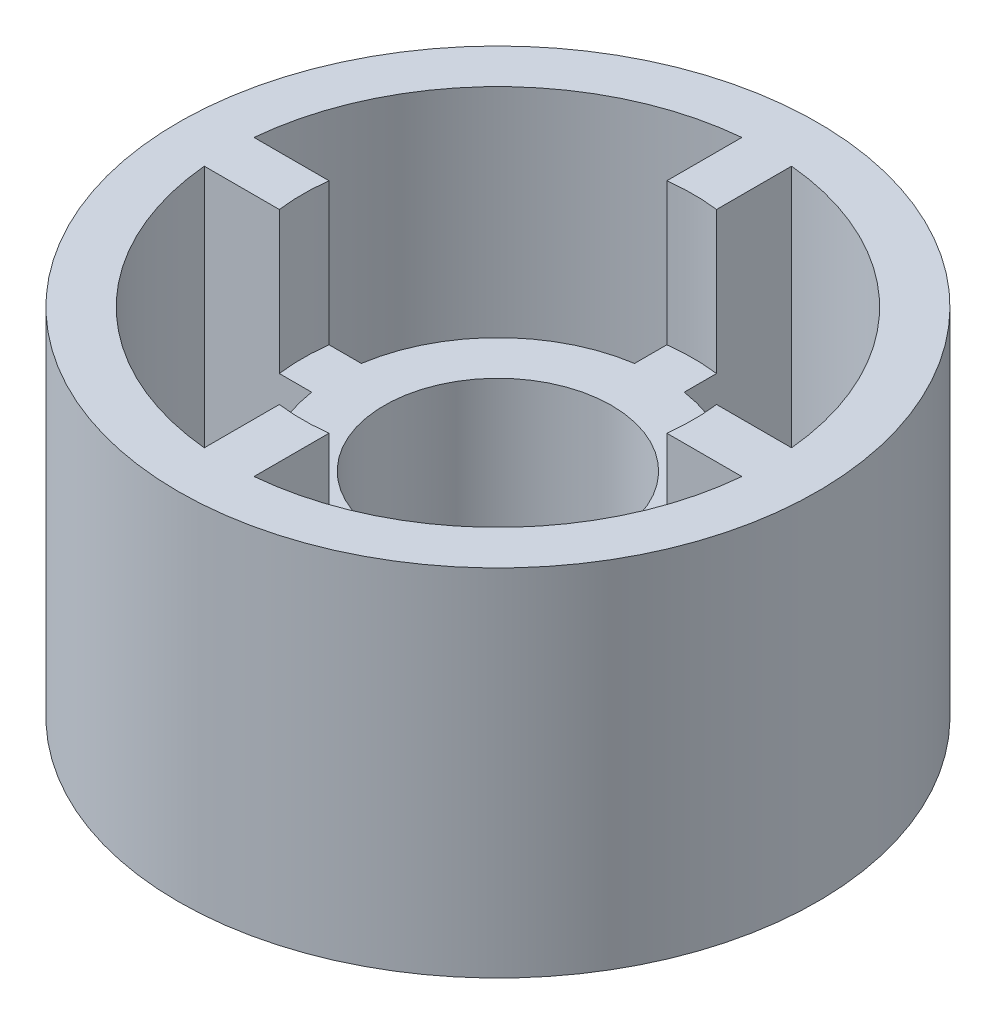
ISO-10303-21;
HEADER;
FILE_DESCRIPTION(('STEP AP214'),'2;1');
FILE_NAME('part.step','',(''),(''),'','','');
FILE_SCHEMA(('AUTOMOTIVE_DESIGN { 1 0 10303 214 1 1 1 1 }'));
ENDSEC;
DATA;
#1=APPLICATION_CONTEXT('core data for automotive mechanical design processes');
#2=APPLICATION_PROTOCOL_DEFINITION('international standard','automotive_design',2000,#1);
#3=PRODUCT_CONTEXT('',#1,'mechanical');
#4=PRODUCT('Part','Part','',(#3));
#5=PRODUCT_RELATED_PRODUCT_CATEGORY('part','',(#4));
#6=PRODUCT_DEFINITION_FORMATION('','',#4);
#7=PRODUCT_DEFINITION_CONTEXT('part definition',#1,'design');
#8=PRODUCT_DEFINITION('design','',#6,#7);
#9=PRODUCT_DEFINITION_SHAPE('','',#8);
#10=(LENGTH_UNIT() NAMED_UNIT(*) SI_UNIT(.MILLI.,.METRE.));
#11=(NAMED_UNIT(*) PLANE_ANGLE_UNIT() SI_UNIT($,.RADIAN.));
#12=(NAMED_UNIT(*) SI_UNIT($,.STERADIAN.) SOLID_ANGLE_UNIT());
#13=UNCERTAINTY_MEASURE_WITH_UNIT(LENGTH_MEASURE(1.E-05),#10,'distance_accuracy_value','');
#14=(GEOMETRIC_REPRESENTATION_CONTEXT(3) GLOBAL_UNCERTAINTY_ASSIGNED_CONTEXT((#13)) GLOBAL_UNIT_ASSIGNED_CONTEXT((#10,
#11,#12)) REPRESENTATION_CONTEXT('',''));
#15=CARTESIAN_POINT('',(0.,0.,0.));
#16=DIRECTION('',(0.,0.,1.));
#17=DIRECTION('',(1.,0.,0.));
#18=AXIS2_PLACEMENT_3D('',#15,#16,#17);
#19=CARTESIAN_POINT('',(0.,5.,0.));
#20=DIRECTION('',(0.,-1.,0.));
#21=DIRECTION('',(0.,0.,-1.));
#22=AXIS2_PLACEMENT_3D('',#19,#20,#21);
#23=CYLINDRICAL_SURFACE('',#22,1.6);
#24=CARTESIAN_POINT('',(0.,0.,0.));
#25=DIRECTION('',(0.,1.,0.));
#26=DIRECTION('',(0.,0.,1.));
#27=AXIS2_PLACEMENT_3D('',#24,#25,#26);
#28=CIRCLE('',#27,1.6);
#29=CARTESIAN_POINT('',(0.,0.,1.6));
#30=VERTEX_POINT('',#29);
#31=EDGE_CURVE('E284',#30,#30,#28,.T.);
#32=ORIENTED_EDGE('',*,*,#31,.F.);
#33=EDGE_LOOP('',(#32));
#34=FACE_BOUND('',#33,.T.);
#35=CARTESIAN_POINT('',(0.,3.,0.));
#36=DIRECTION('',(0.,1.,0.));
#37=DIRECTION('',(0.,0.,1.));
#38=AXIS2_PLACEMENT_3D('',#35,#36,#37);
#39=CIRCLE('',#38,1.6);
#40=CARTESIAN_POINT('',(0.,3.,1.6));
#41=VERTEX_POINT('',#40);
#42=EDGE_CURVE('E388',#41,#41,#39,.T.);
#43=ORIENTED_EDGE('',*,*,#42,.T.);
#44=EDGE_LOOP('',(#43));
#45=FACE_BOUND('',#44,.T.);
#46=ADVANCED_FACE('F35',(#34,#45),#23,.F.);
#47=CARTESIAN_POINT('',(0.,5.,0.));
#48=DIRECTION('',(0.,-1.,0.));
#49=DIRECTION('',(0.,0.,-1.));
#50=AXIS2_PLACEMENT_3D('',#47,#48,#49);
#51=CYLINDRICAL_SURFACE('',#50,2.3);
#52=DIRECTION('',(0.,-1.,0.));
#53=VECTOR('',#52,1.);
#54=CARTESIAN_POINT('',(0.35,5.,-2.27321358433386));
#55=LINE('',#54,#53);
#56=CARTESIAN_POINT('',(0.35,3.,-2.27321358433386));
#57=VERTEX_POINT('',#56);
#58=CARTESIAN_POINT('',(0.35,0.,-2.27321358433386));
#59=VERTEX_POINT('',#58);
#60=EDGE_CURVE('E266',#57,#59,#55,.T.);
#61=ORIENTED_EDGE('',*,*,#60,.F.);
#62=CARTESIAN_POINT('',(0.,3.,0.));
#63=DIRECTION('',(0.,1.,0.));
#64=DIRECTION('',(0.,0.,1.));
#65=AXIS2_PLACEMENT_3D('',#62,#63,#64);
#66=CIRCLE('',#65,2.3);
#67=CARTESIAN_POINT('',(2.27321358433386,3.,-0.35));
#68=VERTEX_POINT('',#67);
#69=EDGE_CURVE('E382',#57,#68,#66,.F.);
#70=ORIENTED_EDGE('',*,*,#69,.T.);
#71=DIRECTION('',(0.,-1.,0.));
#72=VECTOR('',#71,1.);
#73=CARTESIAN_POINT('',(2.27321358433386,5.,-0.35));
#74=LINE('',#73,#72);
#75=CARTESIAN_POINT('',(2.27321358433386,0.,-0.35));
#76=VERTEX_POINT('',#75);
#77=EDGE_CURVE('E282',#68,#76,#74,.T.);
#78=ORIENTED_EDGE('',*,*,#77,.T.);
#79=CARTESIAN_POINT('',(0.,0.,0.));
#80=DIRECTION('',(0.,-1.,0.));
#81=DIRECTION('',(0.,0.,1.));
#82=AXIS2_PLACEMENT_3D('',#79,#80,#81);
#83=CIRCLE('',#82,2.3);
#84=EDGE_CURVE('E256',#59,#76,#83,.T.);
#85=ORIENTED_EDGE('',*,*,#84,.F.);
#86=EDGE_LOOP('',(#61,#70,#78,#85));
#87=FACE_BOUND('',#86,.T.);
#88=ADVANCED_FACE('F454',(#87),#51,.T.);
#89=CARTESIAN_POINT('',(0.,5.,0.));
#90=DIRECTION('',(0.,-1.,0.));
#91=DIRECTION('',(0.,0.,-1.));
#92=AXIS2_PLACEMENT_3D('',#89,#90,#91);
#93=CYLINDRICAL_SURFACE('',#92,2.3);
#94=DIRECTION('',(0.,-1.,0.));
#95=VECTOR('',#94,1.);
#96=CARTESIAN_POINT('',(2.27321358433386,5.,0.35));
#97=LINE('',#96,#95);
#98=CARTESIAN_POINT('',(2.27321358433386,3.,0.35));
#99=VERTEX_POINT('',#98);
#100=CARTESIAN_POINT('',(2.27321358433386,0.,0.35));
#101=VERTEX_POINT('',#100);
#102=EDGE_CURVE('E240',#99,#101,#97,.T.);
#103=ORIENTED_EDGE('',*,*,#102,.F.);
#104=CARTESIAN_POINT('',(0.,3.,0.));
#105=DIRECTION('',(0.,1.,0.));
#106=DIRECTION('',(0.,0.,1.));
#107=AXIS2_PLACEMENT_3D('',#104,#105,#106);
#108=CIRCLE('',#107,2.3);
#109=CARTESIAN_POINT('',(0.35,3.,2.27321358433386));
#110=VERTEX_POINT('',#109);
#111=EDGE_CURVE('E375',#99,#110,#108,.F.);
#112=ORIENTED_EDGE('',*,*,#111,.T.);
#113=DIRECTION('',(0.,-1.,0.));
#114=VECTOR('',#113,1.);
#115=CARTESIAN_POINT('',(0.35,5.,2.27321358433386));
#116=LINE('',#115,#114);
#117=CARTESIAN_POINT('',(0.35,0.,2.27321358433386));
#118=VERTEX_POINT('',#117);
#119=EDGE_CURVE('E254',#110,#118,#116,.T.);
#120=ORIENTED_EDGE('',*,*,#119,.T.);
#121=CARTESIAN_POINT('',(0.,0.,0.));
#122=DIRECTION('',(0.,-1.,0.));
#123=DIRECTION('',(0.,0.,1.));
#124=AXIS2_PLACEMENT_3D('',#121,#122,#123);
#125=CIRCLE('',#124,2.3);
#126=EDGE_CURVE('E241',#101,#118,#125,.T.);
#127=ORIENTED_EDGE('',*,*,#126,.F.);
#128=EDGE_LOOP('',(#103,#112,#120,#127));
#129=FACE_BOUND('',#128,.T.);
#130=ADVANCED_FACE('F479',(#129),#93,.T.);
#131=CARTESIAN_POINT('',(0.,5.,0.));
#132=DIRECTION('',(0.,-1.,0.));
#133=DIRECTION('',(0.,0.,-1.));
#134=AXIS2_PLACEMENT_3D('',#131,#132,#133);
#135=CYLINDRICAL_SURFACE('',#134,2.3);
#136=DIRECTION('',(0.,-1.,0.));
#137=VECTOR('',#136,1.);
#138=CARTESIAN_POINT('',(-0.35,5.,2.27321358433386));
#139=LINE('',#138,#137);
#140=CARTESIAN_POINT('',(-0.35,3.,2.27321358433386));
#141=VERTEX_POINT('',#140);
#142=CARTESIAN_POINT('',(-0.35,0.,2.27321358433386));
#143=VERTEX_POINT('',#142);
#144=EDGE_CURVE('E327',#141,#143,#139,.T.);
#145=ORIENTED_EDGE('',*,*,#144,.F.);
#146=CARTESIAN_POINT('',(0.,3.,0.));
#147=DIRECTION('',(0.,1.,0.));
#148=DIRECTION('',(0.,0.,1.));
#149=AXIS2_PLACEMENT_3D('',#146,#147,#148);
#150=CIRCLE('',#149,2.3);
#151=CARTESIAN_POINT('',(-2.27321358433386,3.,0.35));
#152=VERTEX_POINT('',#151);
#153=EDGE_CURVE('E351',#141,#152,#150,.F.);
#154=ORIENTED_EDGE('',*,*,#153,.T.);
#155=DIRECTION('',(0.,-1.,0.));
#156=VECTOR('',#155,1.);
#157=CARTESIAN_POINT('',(-2.27321358433386,5.,0.35));
#158=LINE('',#157,#156);
#159=CARTESIAN_POINT('',(-2.27321358433386,0.,0.35));
#160=VERTEX_POINT('',#159);
#161=EDGE_CURVE('E235',#152,#160,#158,.T.);
#162=ORIENTED_EDGE('',*,*,#161,.T.);
#163=CARTESIAN_POINT('',(0.,0.,0.));
#164=DIRECTION('',(0.,-1.,0.));
#165=DIRECTION('',(0.,0.,1.));
#166=AXIS2_PLACEMENT_3D('',#163,#164,#165);
#167=CIRCLE('',#166,2.3);
#168=EDGE_CURVE('E318',#143,#160,#167,.T.);
#169=ORIENTED_EDGE('',*,*,#168,.F.);
#170=EDGE_LOOP('',(#145,#154,#162,#169));
#171=FACE_BOUND('',#170,.T.);
#172=ADVANCED_FACE('F350',(#171),#135,.T.);
#173=CARTESIAN_POINT('',(0.,5.,0.));
#174=DIRECTION('',(0.,-1.,0.));
#175=DIRECTION('',(0.,0.,-1.));
#176=AXIS2_PLACEMENT_3D('',#173,#174,#175);
#177=CYLINDRICAL_SURFACE('',#176,2.3);
#178=DIRECTION('',(0.,-1.,0.));
#179=VECTOR('',#178,1.);
#180=CARTESIAN_POINT('',(-2.27321358433386,5.,-0.35));
#181=LINE('',#180,#179);
#182=CARTESIAN_POINT('',(-2.27321358433386,3.,-0.35));
#183=VERTEX_POINT('',#182);
#184=CARTESIAN_POINT('',(-2.27321358433386,0.,-0.35));
#185=VERTEX_POINT('',#184);
#186=EDGE_CURVE('E295',#183,#185,#181,.T.);
#187=ORIENTED_EDGE('',*,*,#186,.F.);
#188=CARTESIAN_POINT('',(0.,3.,0.));
#189=DIRECTION('',(0.,1.,0.));
#190=DIRECTION('',(0.,0.,1.));
#191=AXIS2_PLACEMENT_3D('',#188,#189,#190);
#192=CIRCLE('',#191,2.3);
#193=CARTESIAN_POINT('',(-0.35,3.,-2.27321358433386));
#194=VERTEX_POINT('',#193);
#195=EDGE_CURVE('E50',#183,#194,#192,.F.);
#196=ORIENTED_EDGE('',*,*,#195,.T.);
#197=DIRECTION('',(0.,-1.,0.));
#198=VECTOR('',#197,1.);
#199=CARTESIAN_POINT('',(-0.35,5.,-2.27321358433386));
#200=LINE('',#199,#198);
#201=CARTESIAN_POINT('',(-0.35,0.,-2.27321358433386));
#202=VERTEX_POINT('',#201);
#203=EDGE_CURVE('E316',#194,#202,#200,.T.);
#204=ORIENTED_EDGE('',*,*,#203,.T.);
#205=CARTESIAN_POINT('',(0.,0.,0.));
#206=DIRECTION('',(0.,-1.,0.));
#207=DIRECTION('',(0.,0.,1.));
#208=AXIS2_PLACEMENT_3D('',#205,#206,#207);
#209=CIRCLE('',#208,2.3);
#210=EDGE_CURVE('E303',#185,#202,#209,.T.);
#211=ORIENTED_EDGE('',*,*,#210,.F.);
#212=EDGE_LOOP('',(#187,#196,#204,#211));
#213=FACE_BOUND('',#212,.T.);
#214=ADVANCED_FACE('F300',(#213),#177,.T.);
#215=CARTESIAN_POINT('',(0.,5.,0.));
#216=DIRECTION('',(0.,1.,0.));
#217=DIRECTION('',(0.,0.,1.));
#218=AXIS2_PLACEMENT_3D('',#215,#216,#217);
#219=PLANE('',#218);
#220=CARTESIAN_POINT('',(0.,5.,0.));
#221=DIRECTION('',(0.,1.,0.));
#222=DIRECTION('',(0.,0.,1.));
#223=AXIS2_PLACEMENT_3D('',#220,#221,#222);
#224=CIRCLE('',#223,2.75);
#225=CARTESIAN_POINT('',(2.72763633939717,5.,0.35));
#226=VERTEX_POINT('',#225);
#227=CARTESIAN_POINT('',(2.72763633939717,5.,-0.35));
#228=VERTEX_POINT('',#227);
#229=EDGE_CURVE('E209',#226,#228,#224,.T.);
#230=ORIENTED_EDGE('',*,*,#229,.F.);
#231=DIRECTION('',(-1.,0.,0.));
#232=VECTOR('',#231,1.);
#233=CARTESIAN_POINT('',(2.27321358433386,5.,0.35));
#234=LINE('',#233,#232);
#235=CARTESIAN_POINT('',(3.78384724850251,5.,0.35));
#236=VERTEX_POINT('',#235);
#237=EDGE_CURVE('E229',#236,#226,#234,.T.);
#238=ORIENTED_EDGE('',*,*,#237,.F.);
#239=CARTESIAN_POINT('',(0.,5.,0.));
#240=DIRECTION('',(0.,1.,0.));
#241=DIRECTION('',(0.,0.,1.));
#242=AXIS2_PLACEMENT_3D('',#239,#240,#241);
#243=CIRCLE('',#242,3.8);
#244=CARTESIAN_POINT('',(0.35,5.,3.78384724850251));
#245=VERTEX_POINT('',#244);
#246=EDGE_CURVE('E226',#245,#236,#243,.T.);
#247=ORIENTED_EDGE('',*,*,#246,.F.);
#248=DIRECTION('',(0.,0.,1.));
#249=VECTOR('',#248,1.);
#250=CARTESIAN_POINT('',(0.35,5.,2.27321358433386));
#251=LINE('',#250,#249);
#252=CARTESIAN_POINT('',(0.35,5.,2.72763633939717));
#253=VERTEX_POINT('',#252);
#254=EDGE_CURVE('E213',#253,#245,#251,.T.);
#255=ORIENTED_EDGE('',*,*,#254,.F.);
#256=CARTESIAN_POINT('',(-0.35,5.,2.72763633939717));
#257=VERTEX_POINT('',#256);
#258=EDGE_CURVE('E195',#257,#253,#224,.T.);
#259=ORIENTED_EDGE('',*,*,#258,.F.);
#260=DIRECTION('',(0.,0.,-1.));
#261=VECTOR('',#260,1.);
#262=CARTESIAN_POINT('',(-0.35,5.,2.27321358433386));
#263=LINE('',#262,#261);
#264=CARTESIAN_POINT('',(-0.35,5.,3.78384724850251));
#265=VERTEX_POINT('',#264);
#266=EDGE_CURVE('E325',#265,#257,#263,.T.);
#267=ORIENTED_EDGE('',*,*,#266,.F.);
#268=CARTESIAN_POINT('',(0.,5.,0.));
#269=DIRECTION('',(0.,1.,0.));
#270=DIRECTION('',(0.,0.,1.));
#271=AXIS2_PLACEMENT_3D('',#268,#269,#270);
#272=CIRCLE('',#271,3.8);
#273=CARTESIAN_POINT('',(-3.78384724850251,5.,0.349999999999999));
#274=VERTEX_POINT('',#273);
#275=EDGE_CURVE('E321',#274,#265,#272,.T.);
#276=ORIENTED_EDGE('',*,*,#275,.F.);
#277=DIRECTION('',(-1.,0.,0.));
#278=VECTOR('',#277,1.);
#279=CARTESIAN_POINT('',(-2.27321358433386,5.,0.35));
#280=LINE('',#279,#278);
#281=CARTESIAN_POINT('',(-2.72763633939717,5.,0.35));
#282=VERTEX_POINT('',#281);
#283=EDGE_CURVE('E319',#282,#274,#280,.T.);
#284=ORIENTED_EDGE('',*,*,#283,.F.);
#285=CARTESIAN_POINT('',(-2.72763633939717,5.,-0.35));
#286=VERTEX_POINT('',#285);
#287=EDGE_CURVE('E207',#286,#282,#224,.T.);
#288=ORIENTED_EDGE('',*,*,#287,.F.);
#289=DIRECTION('',(1.,0.,0.));
#290=VECTOR('',#289,1.);
#291=CARTESIAN_POINT('',(-2.27321358433386,5.,-0.35));
#292=LINE('',#291,#290);
#293=CARTESIAN_POINT('',(-3.78384724850251,5.,-0.35));
#294=VERTEX_POINT('',#293);
#295=EDGE_CURVE('E305',#294,#286,#292,.T.);
#296=ORIENTED_EDGE('',*,*,#295,.F.);
#297=CARTESIAN_POINT('',(0.,5.,0.));
#298=DIRECTION('',(0.,1.,0.));
#299=DIRECTION('',(0.,0.,1.));
#300=AXIS2_PLACEMENT_3D('',#297,#298,#299);
#301=CIRCLE('',#300,3.8);
#302=CARTESIAN_POINT('',(-0.349999999999999,5.,-3.78384724850251));
#303=VERTEX_POINT('',#302);
#304=EDGE_CURVE('E309',#303,#294,#301,.T.);
#305=ORIENTED_EDGE('',*,*,#304,.F.);
#306=DIRECTION('',(0.,0.,-1.));
#307=VECTOR('',#306,1.);
#308=CARTESIAN_POINT('',(-0.35,5.,-2.27321358433386));
#309=LINE('',#308,#307);
#310=CARTESIAN_POINT('',(-0.35,5.,-2.72763633939717));
#311=VERTEX_POINT('',#310);
#312=EDGE_CURVE('E400',#311,#303,#309,.T.);
#313=ORIENTED_EDGE('',*,*,#312,.F.);
#314=CARTESIAN_POINT('',(0.35,5.,-2.72763633939717));
#315=VERTEX_POINT('',#314);
#316=EDGE_CURVE('E424',#315,#311,#224,.T.);
#317=ORIENTED_EDGE('',*,*,#316,.F.);
#318=DIRECTION('',(0.,0.,1.));
#319=VECTOR('',#318,1.);
#320=CARTESIAN_POINT('',(0.35,5.,-2.27321358433386));
#321=LINE('',#320,#319);
#322=CARTESIAN_POINT('',(0.349999999999999,5.,-3.78384724850251));
#323=VERTEX_POINT('',#322);
#324=EDGE_CURVE('E263',#323,#315,#321,.T.);
#325=ORIENTED_EDGE('',*,*,#324,.F.);
#326=CARTESIAN_POINT('',(0.,5.,0.));
#327=DIRECTION('',(0.,1.,0.));
#328=DIRECTION('',(0.,0.,1.));
#329=AXIS2_PLACEMENT_3D('',#326,#327,#328);
#330=CIRCLE('',#329,3.8);
#331=CARTESIAN_POINT('',(3.78384724850251,5.,-0.35));
#332=VERTEX_POINT('',#331);
#333=EDGE_CURVE('E259',#332,#323,#330,.T.);
#334=ORIENTED_EDGE('',*,*,#333,.F.);
#335=DIRECTION('',(1.,0.,0.));
#336=VECTOR('',#335,1.);
#337=CARTESIAN_POINT('',(2.27321358433386,5.,-0.35));
#338=LINE('',#337,#336);
#339=EDGE_CURVE('E257',#228,#332,#338,.T.);
#340=ORIENTED_EDGE('',*,*,#339,.F.);
#341=EDGE_LOOP('',(#230,#238,#247,#255,#259,#267,#276,#284,#288,#296,#305,#313,#317,#325,#334,#340));
#342=FACE_BOUND('',#341,.T.);
#343=CARTESIAN_POINT('',(0.,5.,0.));
#344=DIRECTION('',(0.,1.,0.));
#345=DIRECTION('',(0.,0.,1.));
#346=AXIS2_PLACEMENT_3D('',#343,#344,#345);
#347=CIRCLE('',#346,4.5);
#348=CARTESIAN_POINT('',(0.,5.,4.5));
#349=VERTEX_POINT('',#348);
#350=EDGE_CURVE('E288',#349,#349,#347,.T.);
#351=ORIENTED_EDGE('',*,*,#350,.T.);
#352=EDGE_LOOP('',(#351));
#353=FACE_BOUND('',#352,.T.);
#354=ADVANCED_FACE('F222',(#342,#353),#219,.T.);
#355=CARTESIAN_POINT('',(0.,0.,0.));
#356=DIRECTION('',(0.,1.,0.));
#357=DIRECTION('',(0.,0.,1.));
#358=AXIS2_PLACEMENT_3D('',#355,#356,#357);
#359=PLANE('',#358);
#360=ORIENTED_EDGE('',*,*,#168,.T.);
#361=DIRECTION('',(-1.,0.,0.));
#362=VECTOR('',#361,1.);
#363=CARTESIAN_POINT('',(-2.27321358433386,0.,0.35));
#364=LINE('',#363,#362);
#365=CARTESIAN_POINT('',(-3.78384724850251,0.,0.349999999999999));
#366=VERTEX_POINT('',#365);
#367=EDGE_CURVE('E330',#160,#366,#364,.T.);
#368=ORIENTED_EDGE('',*,*,#367,.T.);
#369=CARTESIAN_POINT('',(0.,0.,0.));
#370=DIRECTION('',(0.,1.,0.));
#371=DIRECTION('',(0.,0.,1.));
#372=AXIS2_PLACEMENT_3D('',#369,#370,#371);
#373=CIRCLE('',#372,3.8);
#374=CARTESIAN_POINT('',(-0.35,0.,3.78384724850251));
#375=VERTEX_POINT('',#374);
#376=EDGE_CURVE('E333',#366,#375,#373,.T.);
#377=ORIENTED_EDGE('',*,*,#376,.T.);
#378=DIRECTION('',(0.,0.,-1.));
#379=VECTOR('',#378,1.);
#380=CARTESIAN_POINT('',(-0.35,0.,2.27321358433386));
#381=LINE('',#380,#379);
#382=EDGE_CURVE('E322',#375,#143,#381,.T.);
#383=ORIENTED_EDGE('',*,*,#382,.T.);
#384=EDGE_LOOP('',(#360,#368,#377,#383));
#385=FACE_BOUND('',#384,.T.);
#386=ORIENTED_EDGE('',*,*,#84,.T.);
#387=DIRECTION('',(1.,0.,0.));
#388=VECTOR('',#387,1.);
#389=CARTESIAN_POINT('',(2.27321358433386,0.,-0.35));
#390=LINE('',#389,#388);
#391=CARTESIAN_POINT('',(3.78384724850251,0.,-0.35));
#392=VERTEX_POINT('',#391);
#393=EDGE_CURVE('E269',#76,#392,#390,.T.);
#394=ORIENTED_EDGE('',*,*,#393,.T.);
#395=CARTESIAN_POINT('',(0.,0.,0.));
#396=DIRECTION('',(0.,1.,0.));
#397=DIRECTION('',(0.,0.,1.));
#398=AXIS2_PLACEMENT_3D('',#395,#396,#397);
#399=CIRCLE('',#398,3.8);
#400=CARTESIAN_POINT('',(0.349999999999999,0.,-3.78384724850251));
#401=VERTEX_POINT('',#400);
#402=EDGE_CURVE('E272',#392,#401,#399,.T.);
#403=ORIENTED_EDGE('',*,*,#402,.T.);
#404=DIRECTION('',(0.,0.,1.));
#405=VECTOR('',#404,1.);
#406=CARTESIAN_POINT('',(0.35,0.,-2.27321358433386));
#407=LINE('',#406,#405);
#408=EDGE_CURVE('E260',#401,#59,#407,.T.);
#409=ORIENTED_EDGE('',*,*,#408,.T.);
#410=EDGE_LOOP('',(#386,#394,#403,#409));
#411=FACE_BOUND('',#410,.T.);
#412=CARTESIAN_POINT('',(0.,0.,0.));
#413=DIRECTION('',(0.,1.,0.));
#414=DIRECTION('',(0.,0.,1.));
#415=AXIS2_PLACEMENT_3D('',#412,#413,#414);
#416=CIRCLE('',#415,4.5);
#417=CARTESIAN_POINT('',(0.,0.,4.5));
#418=VERTEX_POINT('',#417);
#419=EDGE_CURVE('E287',#418,#418,#416,.T.);
#420=ORIENTED_EDGE('',*,*,#419,.F.);
#421=EDGE_LOOP('',(#420));
#422=FACE_BOUND('',#421,.T.);
#423=ORIENTED_EDGE('',*,*,#31,.T.);
#424=EDGE_LOOP('',(#423));
#425=FACE_BOUND('',#424,.T.);
#426=ORIENTED_EDGE('',*,*,#126,.T.);
#427=DIRECTION('',(0.,0.,1.));
#428=VECTOR('',#427,1.);
#429=CARTESIAN_POINT('',(0.35,0.,2.27321358433386));
#430=LINE('',#429,#428);
#431=CARTESIAN_POINT('',(0.35,0.,3.78384724850251));
#432=VERTEX_POINT('',#431);
#433=EDGE_CURVE('E244',#118,#432,#430,.T.);
#434=ORIENTED_EDGE('',*,*,#433,.T.);
#435=CARTESIAN_POINT('',(0.,0.,0.));
#436=DIRECTION('',(0.,1.,0.));
#437=DIRECTION('',(0.,0.,1.));
#438=AXIS2_PLACEMENT_3D('',#435,#436,#437);
#439=CIRCLE('',#438,3.8);
#440=CARTESIAN_POINT('',(3.78384724850251,0.,0.35));
#441=VERTEX_POINT('',#440);
#442=EDGE_CURVE('E232',#432,#441,#439,.T.);
#443=ORIENTED_EDGE('',*,*,#442,.T.);
#444=DIRECTION('',(-1.,0.,0.));
#445=VECTOR('',#444,1.);
#446=CARTESIAN_POINT('',(2.27321358433386,0.,0.35));
#447=LINE('',#446,#445);
#448=EDGE_CURVE('E227',#441,#101,#447,.T.);
#449=ORIENTED_EDGE('',*,*,#448,.T.);
#450=EDGE_LOOP('',(#426,#434,#443,#449));
#451=FACE_BOUND('',#450,.T.);
#452=ORIENTED_EDGE('',*,*,#210,.T.);
#453=DIRECTION('',(0.,0.,-1.));
#454=VECTOR('',#453,1.);
#455=CARTESIAN_POINT('',(-0.35,0.,-2.27321358433386));
#456=LINE('',#455,#454);
#457=CARTESIAN_POINT('',(-0.349999999999999,0.,-3.78384724850251));
#458=VERTEX_POINT('',#457);
#459=EDGE_CURVE('E404',#202,#458,#456,.T.);
#460=ORIENTED_EDGE('',*,*,#459,.T.);
#461=CARTESIAN_POINT('',(0.,0.,0.));
#462=DIRECTION('',(0.,1.,0.));
#463=DIRECTION('',(0.,0.,1.));
#464=AXIS2_PLACEMENT_3D('',#461,#462,#463);
#465=CIRCLE('',#464,3.8);
#466=CARTESIAN_POINT('',(-3.78384724850251,0.,-0.35));
#467=VERTEX_POINT('',#466);
#468=EDGE_CURVE('E406',#458,#467,#465,.T.);
#469=ORIENTED_EDGE('',*,*,#468,.T.);
#470=DIRECTION('',(1.,0.,0.));
#471=VECTOR('',#470,1.);
#472=CARTESIAN_POINT('',(-2.27321358433386,0.,-0.35));
#473=LINE('',#472,#471);
#474=EDGE_CURVE('E312',#467,#185,#473,.T.);
#475=ORIENTED_EDGE('',*,*,#474,.T.);
#476=EDGE_LOOP('',(#452,#460,#469,#475));
#477=FACE_BOUND('',#476,.T.);
#478=ADVANCED_FACE('F356',(#385,#411,#422,#425,#451,#477),#359,.F.);
#479=CARTESIAN_POINT('',(0.,5.,0.));
#480=DIRECTION('',(0.,-1.,0.));
#481=DIRECTION('',(0.,0.,-1.));
#482=AXIS2_PLACEMENT_3D('',#479,#480,#481);
#483=CYLINDRICAL_SURFACE('',#482,4.5);
#484=ORIENTED_EDGE('',*,*,#350,.F.);
#485=EDGE_LOOP('',(#484));
#486=FACE_BOUND('',#485,.T.);
#487=ORIENTED_EDGE('',*,*,#419,.T.);
#488=EDGE_LOOP('',(#487));
#489=FACE_BOUND('',#488,.T.);
#490=ADVANCED_FACE('F37',(#486,#489),#483,.T.);
#491=CARTESIAN_POINT('',(2.27321358433386,5.,-0.35));
#492=DIRECTION('',(0.,0.,-1.));
#493=DIRECTION('',(-1.,0.,0.));
#494=AXIS2_PLACEMENT_3D('',#491,#492,#493);
#495=PLANE('',#494);
#496=DIRECTION('',(0.,1.,0.));
#497=VECTOR('',#496,1.);
#498=CARTESIAN_POINT('',(2.72763633939717,3.,-0.35));
#499=LINE('',#498,#497);
#500=CARTESIAN_POINT('',(2.72763633939717,3.,-0.35));
#501=VERTEX_POINT('',#500);
#502=EDGE_CURVE('E398',#228,#501,#499,.F.);
#503=ORIENTED_EDGE('',*,*,#502,.F.);
#504=ORIENTED_EDGE('',*,*,#339,.T.);
#505=DIRECTION('',(0.,-1.,0.));
#506=VECTOR('',#505,1.);
#507=CARTESIAN_POINT('',(3.78384724850251,5.,-0.35));
#508=LINE('',#507,#506);
#509=EDGE_CURVE('E280',#332,#392,#508,.T.);
#510=ORIENTED_EDGE('',*,*,#509,.T.);
#511=ORIENTED_EDGE('',*,*,#393,.F.);
#512=ORIENTED_EDGE('',*,*,#77,.F.);
#513=DIRECTION('',(1.,0.,0.));
#514=VECTOR('',#513,1.);
#515=CARTESIAN_POINT('',(2.27321358433386,3.,-0.35));
#516=LINE('',#515,#514);
#517=EDGE_CURVE('E385',#68,#501,#516,.T.);
#518=ORIENTED_EDGE('',*,*,#517,.T.);
#519=EDGE_LOOP('',(#503,#504,#510,#511,#512,#518));
#520=FACE_BOUND('',#519,.T.);
#521=ADVANCED_FACE('F439',(#520),#495,.T.);
#522=CARTESIAN_POINT('',(0.,5.,0.));
#523=DIRECTION('',(0.,-1.,0.));
#524=DIRECTION('',(0.,0.,-1.));
#525=AXIS2_PLACEMENT_3D('',#522,#523,#524);
#526=CYLINDRICAL_SURFACE('',#525,3.8);
#527=ORIENTED_EDGE('',*,*,#402,.F.);
#528=ORIENTED_EDGE('',*,*,#509,.F.);
#529=ORIENTED_EDGE('',*,*,#333,.T.);
#530=DIRECTION('',(0.,-1.,0.));
#531=VECTOR('',#530,1.);
#532=CARTESIAN_POINT('',(0.349999999999999,5.,-3.78384724850251));
#533=LINE('',#532,#531);
#534=EDGE_CURVE('E278',#323,#401,#533,.T.);
#535=ORIENTED_EDGE('',*,*,#534,.T.);
#536=EDGE_LOOP('',(#527,#528,#529,#535));
#537=FACE_BOUND('',#536,.T.);
#538=ADVANCED_FACE('F447',(#537),#526,.F.);
#539=CARTESIAN_POINT('',(0.35,5.,-2.27321358433386));
#540=DIRECTION('',(1.,0.,0.));
#541=DIRECTION('',(0.,0.,-1.));
#542=AXIS2_PLACEMENT_3D('',#539,#540,#541);
#543=PLANE('',#542);
#544=DIRECTION('',(0.,1.,0.));
#545=VECTOR('',#544,1.);
#546=CARTESIAN_POINT('',(0.35,3.,-2.72763633939717));
#547=LINE('',#546,#545);
#548=CARTESIAN_POINT('',(0.35,3.,-2.72763633939717));
#549=VERTEX_POINT('',#548);
#550=EDGE_CURVE('E217',#549,#315,#547,.T.);
#551=ORIENTED_EDGE('',*,*,#550,.F.);
#552=DIRECTION('',(0.,0.,1.));
#553=VECTOR('',#552,1.);
#554=CARTESIAN_POINT('',(0.35,3.,-2.27321358433386));
#555=LINE('',#554,#553);
#556=EDGE_CURVE('E379',#549,#57,#555,.T.);
#557=ORIENTED_EDGE('',*,*,#556,.T.);
#558=ORIENTED_EDGE('',*,*,#60,.T.);
#559=ORIENTED_EDGE('',*,*,#408,.F.);
#560=ORIENTED_EDGE('',*,*,#534,.F.);
#561=ORIENTED_EDGE('',*,*,#324,.T.);
#562=EDGE_LOOP('',(#551,#557,#558,#559,#560,#561));
#563=FACE_BOUND('',#562,.T.);
#564=ADVANCED_FACE('F459',(#563),#543,.T.);
#565=CARTESIAN_POINT('',(0.35,5.,2.27321358433386));
#566=DIRECTION('',(1.,0.,0.));
#567=DIRECTION('',(0.,0.,-1.));
#568=AXIS2_PLACEMENT_3D('',#565,#566,#567);
#569=PLANE('',#568);
#570=DIRECTION('',(0.,1.,0.));
#571=VECTOR('',#570,1.);
#572=CARTESIAN_POINT('',(0.35,3.,2.72763633939717));
#573=LINE('',#572,#571);
#574=CARTESIAN_POINT('',(0.35,3.,2.72763633939717));
#575=VERTEX_POINT('',#574);
#576=EDGE_CURVE('E199',#253,#575,#573,.F.);
#577=ORIENTED_EDGE('',*,*,#576,.F.);
#578=ORIENTED_EDGE('',*,*,#254,.T.);
#579=DIRECTION('',(0.,-1.,0.));
#580=VECTOR('',#579,1.);
#581=CARTESIAN_POINT('',(0.35,5.,3.78384724850251));
#582=LINE('',#581,#580);
#583=EDGE_CURVE('E252',#245,#432,#582,.T.);
#584=ORIENTED_EDGE('',*,*,#583,.T.);
#585=ORIENTED_EDGE('',*,*,#433,.F.);
#586=ORIENTED_EDGE('',*,*,#119,.F.);
#587=DIRECTION('',(0.,0.,1.));
#588=VECTOR('',#587,1.);
#589=CARTESIAN_POINT('',(0.35,3.,2.27321358433386));
#590=LINE('',#589,#588);
#591=EDGE_CURVE('E216',#110,#575,#590,.T.);
#592=ORIENTED_EDGE('',*,*,#591,.T.);
#593=EDGE_LOOP('',(#577,#578,#584,#585,#586,#592));
#594=FACE_BOUND('',#593,.T.);
#595=ADVANCED_FACE('F212',(#594),#569,.T.);
#596=CARTESIAN_POINT('',(0.,5.,0.));
#597=DIRECTION('',(0.,-1.,0.));
#598=DIRECTION('',(0.,0.,-1.));
#599=AXIS2_PLACEMENT_3D('',#596,#597,#598);
#600=CYLINDRICAL_SURFACE('',#599,3.8);
#601=ORIENTED_EDGE('',*,*,#442,.F.);
#602=ORIENTED_EDGE('',*,*,#583,.F.);
#603=ORIENTED_EDGE('',*,*,#246,.T.);
#604=DIRECTION('',(0.,-1.,0.));
#605=VECTOR('',#604,1.);
#606=CARTESIAN_POINT('',(3.78384724850251,5.,0.35));
#607=LINE('',#606,#605);
#608=EDGE_CURVE('E250',#236,#441,#607,.T.);
#609=ORIENTED_EDGE('',*,*,#608,.T.);
#610=EDGE_LOOP('',(#601,#602,#603,#609));
#611=FACE_BOUND('',#610,.T.);
#612=ADVANCED_FACE('F506',(#611),#600,.F.);
#613=CARTESIAN_POINT('',(2.27321358433386,5.,0.35));
#614=DIRECTION('',(0.,0.,1.));
#615=DIRECTION('',(1.,0.,0.));
#616=AXIS2_PLACEMENT_3D('',#613,#614,#615);
#617=PLANE('',#616);
#618=DIRECTION('',(0.,1.,0.));
#619=VECTOR('',#618,1.);
#620=CARTESIAN_POINT('',(2.72763633939717,3.,0.35));
#621=LINE('',#620,#619);
#622=CARTESIAN_POINT('',(2.72763633939717,3.,0.35));
#623=VERTEX_POINT('',#622);
#624=EDGE_CURVE('E218',#623,#226,#621,.T.);
#625=ORIENTED_EDGE('',*,*,#624,.F.);
#626=DIRECTION('',(-1.,0.,0.));
#627=VECTOR('',#626,1.);
#628=CARTESIAN_POINT('',(2.27321358433386,3.,0.35));
#629=LINE('',#628,#627);
#630=EDGE_CURVE('E372',#623,#99,#629,.T.);
#631=ORIENTED_EDGE('',*,*,#630,.T.);
#632=ORIENTED_EDGE('',*,*,#102,.T.);
#633=ORIENTED_EDGE('',*,*,#448,.F.);
#634=ORIENTED_EDGE('',*,*,#608,.F.);
#635=ORIENTED_EDGE('',*,*,#237,.T.);
#636=EDGE_LOOP('',(#625,#631,#632,#633,#634,#635));
#637=FACE_BOUND('',#636,.T.);
#638=ADVANCED_FACE('F508',(#637),#617,.T.);
#639=CARTESIAN_POINT('',(-2.27321358433386,5.,0.35));
#640=DIRECTION('',(0.,0.,1.));
#641=DIRECTION('',(1.,0.,0.));
#642=AXIS2_PLACEMENT_3D('',#639,#640,#641);
#643=PLANE('',#642);
#644=DIRECTION('',(0.,1.,0.));
#645=VECTOR('',#644,1.);
#646=CARTESIAN_POINT('',(-2.72763633939717,3.,0.35));
#647=LINE('',#646,#645);
#648=CARTESIAN_POINT('',(-2.72763633939717,3.,0.35));
#649=VERTEX_POINT('',#648);
#650=EDGE_CURVE('E394',#282,#649,#647,.F.);
#651=ORIENTED_EDGE('',*,*,#650,.F.);
#652=ORIENTED_EDGE('',*,*,#283,.T.);
#653=DIRECTION('',(0.,-1.,0.));
#654=VECTOR('',#653,1.);
#655=CARTESIAN_POINT('',(-3.78384724850251,5.,0.349999999999999));
#656=LINE('',#655,#654);
#657=EDGE_CURVE('E340',#274,#366,#656,.T.);
#658=ORIENTED_EDGE('',*,*,#657,.T.);
#659=ORIENTED_EDGE('',*,*,#367,.F.);
#660=ORIENTED_EDGE('',*,*,#161,.F.);
#661=DIRECTION('',(-1.,0.,0.));
#662=VECTOR('',#661,1.);
#663=CARTESIAN_POINT('',(-2.27321358433386,3.,0.35));
#664=LINE('',#663,#662);
#665=EDGE_CURVE('E365',#152,#649,#664,.T.);
#666=ORIENTED_EDGE('',*,*,#665,.T.);
#667=EDGE_LOOP('',(#651,#652,#658,#659,#660,#666));
#668=FACE_BOUND('',#667,.T.);
#669=ADVANCED_FACE('F354',(#668),#643,.T.);
#670=CARTESIAN_POINT('',(0.,5.,0.));
#671=DIRECTION('',(0.,-1.,0.));
#672=DIRECTION('',(0.,0.,-1.));
#673=AXIS2_PLACEMENT_3D('',#670,#671,#672);
#674=CYLINDRICAL_SURFACE('',#673,3.8);
#675=ORIENTED_EDGE('',*,*,#376,.F.);
#676=ORIENTED_EDGE('',*,*,#657,.F.);
#677=ORIENTED_EDGE('',*,*,#275,.T.);
#678=DIRECTION('',(0.,-1.,0.));
#679=VECTOR('',#678,1.);
#680=CARTESIAN_POINT('',(-0.35,5.,3.78384724850251));
#681=LINE('',#680,#679);
#682=EDGE_CURVE('E339',#265,#375,#681,.T.);
#683=ORIENTED_EDGE('',*,*,#682,.T.);
#684=EDGE_LOOP('',(#675,#676,#677,#683));
#685=FACE_BOUND('',#684,.T.);
#686=ADVANCED_FACE('F515',(#685),#674,.F.);
#687=CARTESIAN_POINT('',(-0.35,5.,2.27321358433386));
#688=DIRECTION('',(-1.,0.,0.));
#689=DIRECTION('',(0.,0.,1.));
#690=AXIS2_PLACEMENT_3D('',#687,#688,#689);
#691=PLANE('',#690);
#692=DIRECTION('',(0.,1.,0.));
#693=VECTOR('',#692,1.);
#694=CARTESIAN_POINT('',(-0.35,3.,2.72763633939717));
#695=LINE('',#694,#693);
#696=CARTESIAN_POINT('',(-0.35,3.,2.72763633939717));
#697=VERTEX_POINT('',#696);
#698=EDGE_CURVE('E202',#697,#257,#695,.T.);
#699=ORIENTED_EDGE('',*,*,#698,.F.);
#700=DIRECTION('',(0.,0.,-1.));
#701=VECTOR('',#700,1.);
#702=CARTESIAN_POINT('',(-0.35,3.,2.27321358433386));
#703=LINE('',#702,#701);
#704=EDGE_CURVE('E362',#697,#141,#703,.T.);
#705=ORIENTED_EDGE('',*,*,#704,.T.);
#706=ORIENTED_EDGE('',*,*,#144,.T.);
#707=ORIENTED_EDGE('',*,*,#382,.F.);
#708=ORIENTED_EDGE('',*,*,#682,.F.);
#709=ORIENTED_EDGE('',*,*,#266,.T.);
#710=EDGE_LOOP('',(#699,#705,#706,#707,#708,#709));
#711=FACE_BOUND('',#710,.T.);
#712=ADVANCED_FACE('F360',(#711),#691,.T.);
#713=CARTESIAN_POINT('',(-0.35,5.,-2.27321358433386));
#714=DIRECTION('',(-1.,0.,0.));
#715=DIRECTION('',(0.,0.,1.));
#716=AXIS2_PLACEMENT_3D('',#713,#714,#715);
#717=PLANE('',#716);
#718=DIRECTION('',(0.,1.,0.));
#719=VECTOR('',#718,1.);
#720=CARTESIAN_POINT('',(-0.35,3.,-2.72763633939717));
#721=LINE('',#720,#719);
#722=CARTESIAN_POINT('',(-0.35,3.,-2.72763633939717));
#723=VERTEX_POINT('',#722);
#724=EDGE_CURVE('E391',#311,#723,#721,.F.);
#725=ORIENTED_EDGE('',*,*,#724,.F.);
#726=ORIENTED_EDGE('',*,*,#312,.T.);
#727=DIRECTION('',(0.,-1.,0.));
#728=VECTOR('',#727,1.);
#729=CARTESIAN_POINT('',(-0.349999999999999,5.,-3.78384724850251));
#730=LINE('',#729,#728);
#731=EDGE_CURVE('E307',#303,#458,#730,.T.);
#732=ORIENTED_EDGE('',*,*,#731,.T.);
#733=ORIENTED_EDGE('',*,*,#459,.F.);
#734=ORIENTED_EDGE('',*,*,#203,.F.);
#735=DIRECTION('',(0.,0.,-1.));
#736=VECTOR('',#735,1.);
#737=CARTESIAN_POINT('',(-0.35,3.,-2.27321358433386));
#738=LINE('',#737,#736);
#739=EDGE_CURVE('E363',#194,#723,#738,.T.);
#740=ORIENTED_EDGE('',*,*,#739,.T.);
#741=EDGE_LOOP('',(#725,#726,#732,#733,#734,#740));
#742=FACE_BOUND('',#741,.T.);
#743=ADVANCED_FACE('F413',(#742),#717,.T.);
#744=CARTESIAN_POINT('',(0.,5.,0.));
#745=DIRECTION('',(0.,-1.,0.));
#746=DIRECTION('',(0.,0.,-1.));
#747=AXIS2_PLACEMENT_3D('',#744,#745,#746);
#748=CYLINDRICAL_SURFACE('',#747,3.8);
#749=ORIENTED_EDGE('',*,*,#468,.F.);
#750=ORIENTED_EDGE('',*,*,#731,.F.);
#751=ORIENTED_EDGE('',*,*,#304,.T.);
#752=DIRECTION('',(0.,-1.,0.));
#753=VECTOR('',#752,1.);
#754=CARTESIAN_POINT('',(-3.78384724850251,5.,-0.35));
#755=LINE('',#754,#753);
#756=EDGE_CURVE('E58',#294,#467,#755,.T.);
#757=ORIENTED_EDGE('',*,*,#756,.T.);
#758=EDGE_LOOP('',(#749,#750,#751,#757));
#759=FACE_BOUND('',#758,.T.);
#760=ADVANCED_FACE('F418',(#759),#748,.F.);
#761=CARTESIAN_POINT('',(-2.27321358433386,5.,-0.35));
#762=DIRECTION('',(0.,0.,-1.));
#763=DIRECTION('',(-1.,0.,0.));
#764=AXIS2_PLACEMENT_3D('',#761,#762,#763);
#765=PLANE('',#764);
#766=DIRECTION('',(0.,1.,0.));
#767=VECTOR('',#766,1.);
#768=CARTESIAN_POINT('',(-2.72763633939717,3.,-0.35));
#769=LINE('',#768,#767);
#770=CARTESIAN_POINT('',(-2.72763633939717,3.,-0.35));
#771=VERTEX_POINT('',#770);
#772=EDGE_CURVE('E11',#771,#286,#769,.T.);
#773=ORIENTED_EDGE('',*,*,#772,.F.);
#774=DIRECTION('',(1.,0.,0.));
#775=VECTOR('',#774,1.);
#776=CARTESIAN_POINT('',(-2.27321358433386,3.,-0.35));
#777=LINE('',#776,#775);
#778=EDGE_CURVE('E43',#771,#183,#777,.T.);
#779=ORIENTED_EDGE('',*,*,#778,.T.);
#780=ORIENTED_EDGE('',*,*,#186,.T.);
#781=ORIENTED_EDGE('',*,*,#474,.F.);
#782=ORIENTED_EDGE('',*,*,#756,.F.);
#783=ORIENTED_EDGE('',*,*,#295,.T.);
#784=EDGE_LOOP('',(#773,#779,#780,#781,#782,#783));
#785=FACE_BOUND('',#784,.T.);
#786=ADVANCED_FACE('F294',(#785),#765,.T.);
#787=CARTESIAN_POINT('',(0.,3.,0.));
#788=DIRECTION('',(0.,1.,0.));
#789=DIRECTION('',(0.,0.,1.));
#790=AXIS2_PLACEMENT_3D('',#787,#788,#789);
#791=CYLINDRICAL_SURFACE('',#790,2.75);
#792=ORIENTED_EDGE('',*,*,#502,.T.);
#793=CARTESIAN_POINT('',(0.,3.,0.));
#794=DIRECTION('',(0.,1.,0.));
#795=DIRECTION('',(0.,0.,1.));
#796=AXIS2_PLACEMENT_3D('',#793,#794,#795);
#797=CIRCLE('',#796,2.75);
#798=EDGE_CURVE('E427',#623,#501,#797,.T.);
#799=ORIENTED_EDGE('',*,*,#798,.F.);
#800=ORIENTED_EDGE('',*,*,#624,.T.);
#801=ORIENTED_EDGE('',*,*,#229,.T.);
#802=EDGE_LOOP('',(#792,#799,#800,#801));
#803=FACE_BOUND('',#802,.T.);
#804=ADVANCED_FACE('F435',(#803),#791,.F.);
#805=ORIENTED_EDGE('',*,*,#576,.T.);
#806=EDGE_CURVE('E426',#697,#575,#797,.T.);
#807=ORIENTED_EDGE('',*,*,#806,.F.);
#808=ORIENTED_EDGE('',*,*,#698,.T.);
#809=ORIENTED_EDGE('',*,*,#258,.T.);
#810=EDGE_LOOP('',(#805,#807,#808,#809));
#811=FACE_BOUND('',#810,.T.);
#812=ADVANCED_FACE('F197',(#811),#791,.F.);
#813=ORIENTED_EDGE('',*,*,#650,.T.);
#814=EDGE_CURVE('E432',#771,#649,#797,.T.);
#815=ORIENTED_EDGE('',*,*,#814,.F.);
#816=ORIENTED_EDGE('',*,*,#772,.T.);
#817=ORIENTED_EDGE('',*,*,#287,.T.);
#818=EDGE_LOOP('',(#813,#815,#816,#817));
#819=FACE_BOUND('',#818,.T.);
#820=ADVANCED_FACE('F463',(#819),#791,.F.);
#821=ORIENTED_EDGE('',*,*,#550,.T.);
#822=ORIENTED_EDGE('',*,*,#316,.T.);
#823=ORIENTED_EDGE('',*,*,#724,.T.);
#824=EDGE_CURVE('E429',#549,#723,#797,.T.);
#825=ORIENTED_EDGE('',*,*,#824,.F.);
#826=EDGE_LOOP('',(#821,#822,#823,#825));
#827=FACE_BOUND('',#826,.T.);
#828=ADVANCED_FACE('F461',(#827),#791,.F.);
#829=CARTESIAN_POINT('',(0.,3.,0.));
#830=DIRECTION('',(0.,1.,0.));
#831=DIRECTION('',(0.,0.,1.));
#832=AXIS2_PLACEMENT_3D('',#829,#830,#831);
#833=PLANE('',#832);
#834=ORIENTED_EDGE('',*,*,#42,.F.);
#835=EDGE_LOOP('',(#834));
#836=FACE_BOUND('',#835,.T.);
#837=ORIENTED_EDGE('',*,*,#69,.F.);
#838=ORIENTED_EDGE('',*,*,#556,.F.);
#839=ORIENTED_EDGE('',*,*,#824,.T.);
#840=ORIENTED_EDGE('',*,*,#739,.F.);
#841=ORIENTED_EDGE('',*,*,#195,.F.);
#842=ORIENTED_EDGE('',*,*,#778,.F.);
#843=ORIENTED_EDGE('',*,*,#814,.T.);
#844=ORIENTED_EDGE('',*,*,#665,.F.);
#845=ORIENTED_EDGE('',*,*,#153,.F.);
#846=ORIENTED_EDGE('',*,*,#704,.F.);
#847=ORIENTED_EDGE('',*,*,#806,.T.);
#848=ORIENTED_EDGE('',*,*,#591,.F.);
#849=ORIENTED_EDGE('',*,*,#111,.F.);
#850=ORIENTED_EDGE('',*,*,#630,.F.);
#851=ORIENTED_EDGE('',*,*,#798,.T.);
#852=ORIENTED_EDGE('',*,*,#517,.F.);
#853=EDGE_LOOP('',(#837,#838,#839,#840,#841,#842,#843,#844,#845,#846,#847,#848,#849,#850,#851,#852));
#854=FACE_BOUND('',#853,.T.);
#855=ADVANCED_FACE('F455',(#836,#854),#833,.T.);
#856=CLOSED_SHELL('',(#46,#88,#130,#172,#214,#354,#478,#490,#521,#538,#564,#595,#612,#638,#669,
#686,#712,#743,#760,#786,#804,#812,#820,#828,#855));
#857=MANIFOLD_SOLID_BREP('B2',#856);
#858=ADVANCED_BREP_SHAPE_REPRESENTATION('',(#18,#857),#14);
#859=SHAPE_DEFINITION_REPRESENTATION(#9,#858);
ENDSEC;
END-ISO-10303-21;
